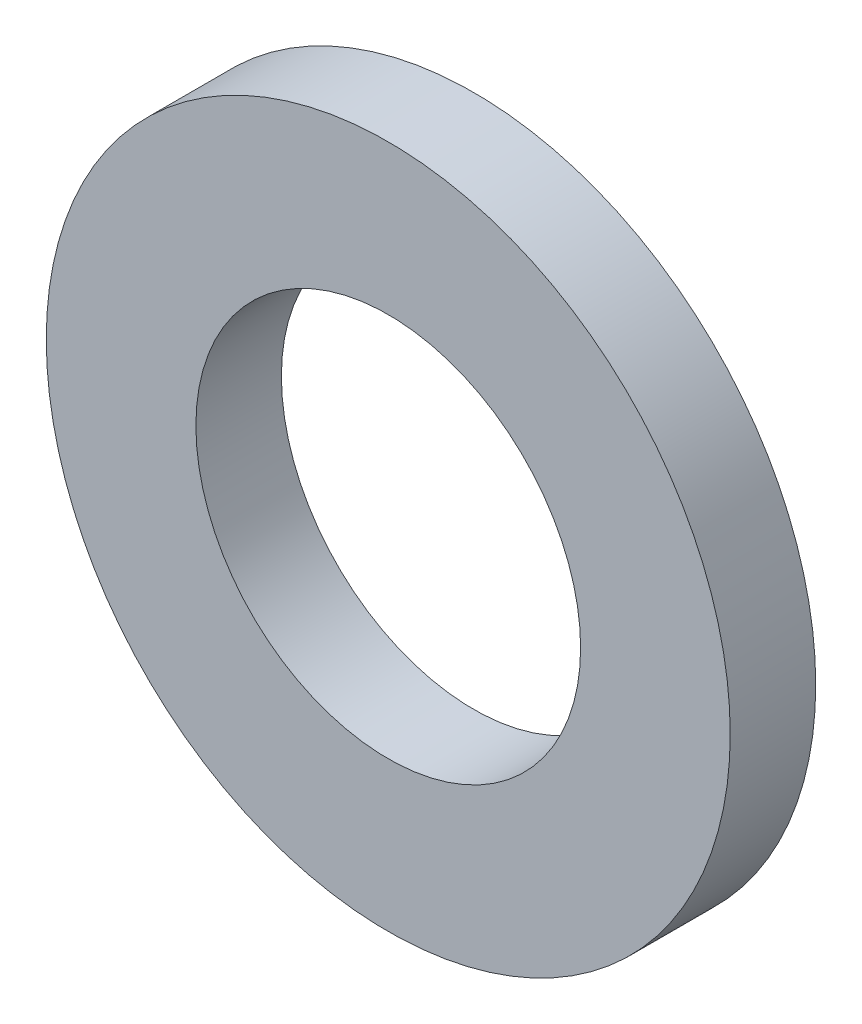
ISO-10303-21;
HEADER;
FILE_DESCRIPTION(('STEP AP214'),'2;1');
FILE_NAME('part.step','',(''),(''),'','','');
FILE_SCHEMA(('AUTOMOTIVE_DESIGN { 1 0 10303 214 1 1 1 1 }'));
ENDSEC;
DATA;
#1=APPLICATION_CONTEXT('core data for automotive mechanical design processes');
#2=APPLICATION_PROTOCOL_DEFINITION('international standard','automotive_design',2000,#1);
#3=PRODUCT_CONTEXT('',#1,'mechanical');
#4=PRODUCT('Part','Part','',(#3));
#5=PRODUCT_RELATED_PRODUCT_CATEGORY('part','',(#4));
#6=PRODUCT_DEFINITION_FORMATION('','',#4);
#7=PRODUCT_DEFINITION_CONTEXT('part definition',#1,'design');
#8=PRODUCT_DEFINITION('design','',#6,#7);
#9=PRODUCT_DEFINITION_SHAPE('','',#8);
#10=(LENGTH_UNIT() NAMED_UNIT(*) SI_UNIT(.MILLI.,.METRE.));
#11=(NAMED_UNIT(*) PLANE_ANGLE_UNIT() SI_UNIT($,.RADIAN.));
#12=(NAMED_UNIT(*) SI_UNIT($,.STERADIAN.) SOLID_ANGLE_UNIT());
#13=UNCERTAINTY_MEASURE_WITH_UNIT(LENGTH_MEASURE(1.E-05),#10,'distance_accuracy_value','');
#14=(GEOMETRIC_REPRESENTATION_CONTEXT(3) GLOBAL_UNCERTAINTY_ASSIGNED_CONTEXT((#13)) GLOBAL_UNIT_ASSIGNED_CONTEXT((#10,
#11,#12)) REPRESENTATION_CONTEXT('',''));
#15=CARTESIAN_POINT('',(0.,0.,0.));
#16=DIRECTION('',(0.,0.,1.));
#17=DIRECTION('',(1.,0.,0.));
#18=AXIS2_PLACEMENT_3D('',#15,#16,#17);
#19=CARTESIAN_POINT('',(0.,0.,2.));
#20=DIRECTION('',(0.,0.,1.));
#21=DIRECTION('',(1.,0.,0.));
#22=AXIS2_PLACEMENT_3D('',#19,#20,#21);
#23=PLANE('',#22);
#24=CARTESIAN_POINT('',(0.,0.,2.));
#25=DIRECTION('',(0.,0.,1.));
#26=DIRECTION('',(1.,0.,0.));
#27=AXIS2_PLACEMENT_3D('',#24,#25,#26);
#28=CIRCLE('',#27,8.);
#29=CARTESIAN_POINT('',(8.,0.,2.));
#30=VERTEX_POINT('',#29);
#31=EDGE_CURVE('E10',#30,#30,#28,.T.);
#32=ORIENTED_EDGE('',*,*,#31,.T.);
#33=EDGE_LOOP('',(#32));
#34=FACE_BOUND('',#33,.T.);
#35=CARTESIAN_POINT('',(0.,0.,2.));
#36=DIRECTION('',(0.,0.,1.));
#37=DIRECTION('',(1.,0.,0.));
#38=AXIS2_PLACEMENT_3D('',#35,#36,#37);
#39=CIRCLE('',#38,4.5);
#40=CARTESIAN_POINT('',(4.5,0.,2.));
#41=VERTEX_POINT('',#40);
#42=EDGE_CURVE('E42',#41,#41,#39,.T.);
#43=ORIENTED_EDGE('',*,*,#42,.F.);
#44=EDGE_LOOP('',(#43));
#45=FACE_BOUND('',#44,.T.);
#46=ADVANCED_FACE('F31',(#34,#45),#23,.T.);
#47=CARTESIAN_POINT('',(0.,0.,0.));
#48=DIRECTION('',(0.,0.,1.));
#49=DIRECTION('',(1.,0.,0.));
#50=AXIS2_PLACEMENT_3D('',#47,#48,#49);
#51=PLANE('',#50);
#52=CARTESIAN_POINT('',(0.,0.,0.));
#53=DIRECTION('',(0.,0.,1.));
#54=DIRECTION('',(1.,0.,0.));
#55=AXIS2_PLACEMENT_3D('',#52,#53,#54);
#56=CIRCLE('',#55,8.);
#57=CARTESIAN_POINT('',(8.,0.,0.));
#58=VERTEX_POINT('',#57);
#59=EDGE_CURVE('E35',#58,#58,#56,.T.);
#60=ORIENTED_EDGE('',*,*,#59,.F.);
#61=EDGE_LOOP('',(#60));
#62=FACE_BOUND('',#61,.T.);
#63=CARTESIAN_POINT('',(0.,0.,0.));
#64=DIRECTION('',(0.,0.,1.));
#65=DIRECTION('',(1.,0.,0.));
#66=AXIS2_PLACEMENT_3D('',#63,#64,#65);
#67=CIRCLE('',#66,4.5);
#68=CARTESIAN_POINT('',(4.5,0.,0.));
#69=VERTEX_POINT('',#68);
#70=EDGE_CURVE('E44',#69,#69,#67,.T.);
#71=ORIENTED_EDGE('',*,*,#70,.T.);
#72=EDGE_LOOP('',(#71));
#73=FACE_BOUND('',#72,.T.);
#74=ADVANCED_FACE('F54',(#62,#73),#51,.F.);
#75=CARTESIAN_POINT('',(0.,0.,2.));
#76=DIRECTION('',(0.,0.,-1.));
#77=DIRECTION('',(-1.,0.,0.));
#78=AXIS2_PLACEMENT_3D('',#75,#76,#77);
#79=CYLINDRICAL_SURFACE('',#78,8.);
#80=ORIENTED_EDGE('',*,*,#31,.F.);
#81=EDGE_LOOP('',(#80));
#82=FACE_BOUND('',#81,.T.);
#83=ORIENTED_EDGE('',*,*,#59,.T.);
#84=EDGE_LOOP('',(#83));
#85=FACE_BOUND('',#84,.T.);
#86=ADVANCED_FACE('F33',(#82,#85),#79,.T.);
#87=CARTESIAN_POINT('',(0.,0.,2.));
#88=DIRECTION('',(0.,0.,-1.));
#89=DIRECTION('',(-1.,0.,0.));
#90=AXIS2_PLACEMENT_3D('',#87,#88,#89);
#91=CYLINDRICAL_SURFACE('',#90,4.5);
#92=ORIENTED_EDGE('',*,*,#42,.T.);
#93=EDGE_LOOP('',(#92));
#94=FACE_BOUND('',#93,.T.);
#95=ORIENTED_EDGE('',*,*,#70,.F.);
#96=EDGE_LOOP('',(#95));
#97=FACE_BOUND('',#96,.T.);
#98=ADVANCED_FACE('F50',(#94,#97),#91,.F.);
#99=CLOSED_SHELL('',(#46,#74,#86,#98));
#100=MANIFOLD_SOLID_BREP('B2',#99);
#101=ADVANCED_BREP_SHAPE_REPRESENTATION('',(#18,#100),#14);
#102=SHAPE_DEFINITION_REPRESENTATION(#9,#101);
ENDSEC;
END-ISO-10303-21;
